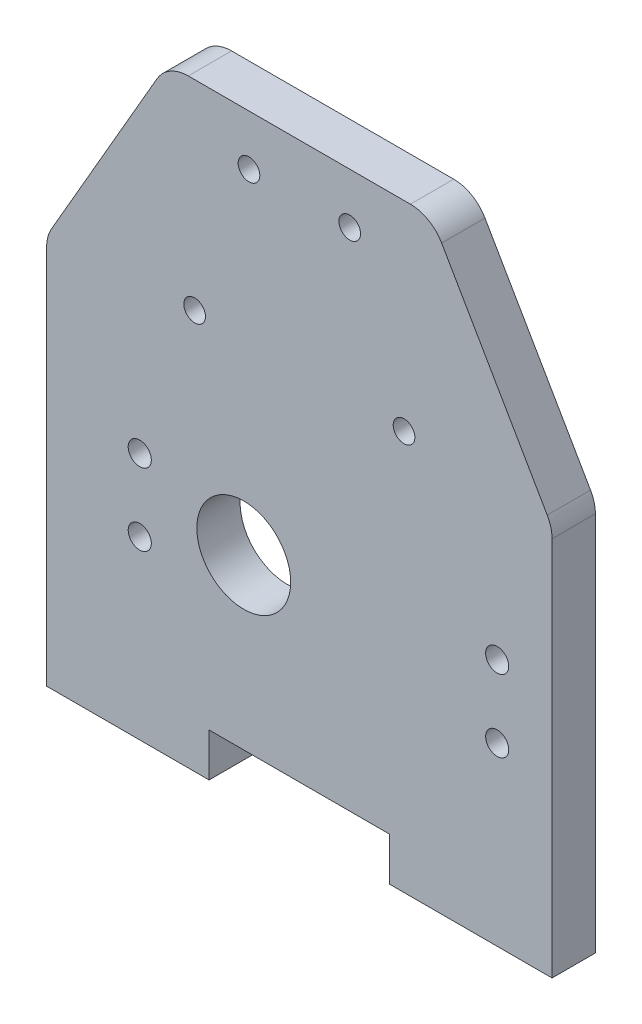
ISO-10303-21;
HEADER;
FILE_DESCRIPTION(('STEP AP214'),'2;1');
FILE_NAME('part.step','',(''),(''),'','','');
FILE_SCHEMA(('AUTOMOTIVE_DESIGN { 1 0 10303 214 1 1 1 1 }'));
ENDSEC;
DATA;
#1=APPLICATION_CONTEXT('core data for automotive mechanical design processes');
#2=APPLICATION_PROTOCOL_DEFINITION('international standard','automotive_design',2000,#1);
#3=PRODUCT_CONTEXT('',#1,'mechanical');
#4=PRODUCT('Part','Part','',(#3));
#5=PRODUCT_RELATED_PRODUCT_CATEGORY('part','',(#4));
#6=PRODUCT_DEFINITION_FORMATION('','',#4);
#7=PRODUCT_DEFINITION_CONTEXT('part definition',#1,'design');
#8=PRODUCT_DEFINITION('design','',#6,#7);
#9=PRODUCT_DEFINITION_SHAPE('','',#8);
#10=(LENGTH_UNIT() NAMED_UNIT(*) SI_UNIT(.MILLI.,.METRE.));
#11=(NAMED_UNIT(*) PLANE_ANGLE_UNIT() SI_UNIT($,.RADIAN.));
#12=(NAMED_UNIT(*) SI_UNIT($,.STERADIAN.) SOLID_ANGLE_UNIT());
#13=UNCERTAINTY_MEASURE_WITH_UNIT(LENGTH_MEASURE(1.E-05),#10,'distance_accuracy_value','');
#14=(GEOMETRIC_REPRESENTATION_CONTEXT(3) GLOBAL_UNCERTAINTY_ASSIGNED_CONTEXT((#13)) GLOBAL_UNIT_ASSIGNED_CONTEXT((#10,
#11,#12)) REPRESENTATION_CONTEXT('',''));
#15=CARTESIAN_POINT('',(0.,0.,0.));
#16=DIRECTION('',(0.,0.,1.));
#17=DIRECTION('',(1.,0.,0.));
#18=AXIS2_PLACEMENT_3D('',#15,#16,#17);
#19=CARTESIAN_POINT('',(0.,-40.,6.));
#20=DIRECTION('',(0.,1.,0.));
#21=DIRECTION('',(-1.,0.,0.));
#22=AXIS2_PLACEMENT_3D('',#19,#20,#21);
#23=PLANE('',#22);
#24=DIRECTION('',(1.,0.,0.));
#25=VECTOR('',#24,1.);
#26=CARTESIAN_POINT('',(0.,-40.,0.));
#27=LINE('',#26,#25);
#28=CARTESIAN_POINT('',(-35.,-40.,0.));
#29=VERTEX_POINT('',#28);
#30=CARTESIAN_POINT('',(-12.5,-40.,0.));
#31=VERTEX_POINT('',#30);
#32=EDGE_CURVE('E250',#29,#31,#27,.T.);
#33=ORIENTED_EDGE('',*,*,#32,.T.);
#34=DIRECTION('',(0.,0.,-1.));
#35=VECTOR('',#34,1.);
#36=CARTESIAN_POINT('',(-12.5,-40.,10.));
#37=LINE('',#36,#35);
#38=CARTESIAN_POINT('',(-12.5,-40.,6.));
#39=VERTEX_POINT('',#38);
#40=EDGE_CURVE('E170',#39,#31,#37,.T.);
#41=ORIENTED_EDGE('',*,*,#40,.F.);
#42=DIRECTION('',(1.,0.,0.));
#43=VECTOR('',#42,1.);
#44=CARTESIAN_POINT('',(0.,-40.,6.));
#45=LINE('',#44,#43);
#46=CARTESIAN_POINT('',(-35.,-40.,6.));
#47=VERTEX_POINT('',#46);
#48=EDGE_CURVE('E240',#47,#39,#45,.T.);
#49=ORIENTED_EDGE('',*,*,#48,.F.);
#50=DIRECTION('',(0.,0.,-1.));
#51=VECTOR('',#50,1.);
#52=CARTESIAN_POINT('',(-35.,-40.,6.));
#53=LINE('',#52,#51);
#54=EDGE_CURVE('E234',#47,#29,#53,.T.);
#55=ORIENTED_EDGE('',*,*,#54,.T.);
#56=EDGE_LOOP('',(#33,#41,#49,#55));
#57=FACE_BOUND('',#56,.T.);
#58=ADVANCED_FACE('F37',(#57),#23,.F.);
#59=CARTESIAN_POINT('',(12.5,-40.,6.));
#60=VERTEX_POINT('',#59);
#61=CARTESIAN_POINT('',(35.,-40.,6.));
#62=VERTEX_POINT('',#61);
#63=EDGE_CURVE('E244',#60,#62,#45,.T.);
#64=ORIENTED_EDGE('',*,*,#63,.F.);
#65=DIRECTION('',(0.,0.,-1.));
#66=VECTOR('',#65,1.);
#67=CARTESIAN_POINT('',(12.5,-40.,10.));
#68=LINE('',#67,#66);
#69=CARTESIAN_POINT('',(12.5,-40.,0.));
#70=VERTEX_POINT('',#69);
#71=EDGE_CURVE('E149',#60,#70,#68,.T.);
#72=ORIENTED_EDGE('',*,*,#71,.T.);
#73=CARTESIAN_POINT('',(35.,-40.,0.));
#74=VERTEX_POINT('',#73);
#75=EDGE_CURVE('E165',#70,#74,#27,.T.);
#76=ORIENTED_EDGE('',*,*,#75,.T.);
#77=DIRECTION('',(0.,0.,-1.));
#78=VECTOR('',#77,1.);
#79=CARTESIAN_POINT('',(35.,-40.,6.));
#80=LINE('',#79,#78);
#81=EDGE_CURVE('E249',#62,#74,#80,.T.);
#82=ORIENTED_EDGE('',*,*,#81,.F.);
#83=EDGE_LOOP('',(#64,#72,#76,#82));
#84=FACE_BOUND('',#83,.T.);
#85=ADVANCED_FACE('F315',(#84),#23,.F.);
#86=CARTESIAN_POINT('',(35.,-40.,6.));
#87=DIRECTION('',(-1.,0.,0.));
#88=DIRECTION('',(0.,-1.,0.));
#89=AXIS2_PLACEMENT_3D('',#86,#87,#88);
#90=PLANE('',#89);
#91=DIRECTION('',(0.,1.,0.));
#92=VECTOR('',#91,1.);
#93=CARTESIAN_POINT('',(35.,-40.,0.));
#94=LINE('',#93,#92);
#95=CARTESIAN_POINT('',(35.,12.6794919243112,0.));
#96=VERTEX_POINT('',#95);
#97=EDGE_CURVE('E253',#74,#96,#94,.T.);
#98=ORIENTED_EDGE('',*,*,#97,.T.);
#99=DIRECTION('',(0.,0.,-1.));
#100=VECTOR('',#99,1.);
#101=CARTESIAN_POINT('',(35.,12.6794919243112,6.));
#102=LINE('',#101,#100);
#103=CARTESIAN_POINT('',(35.,12.6794919243112,6.));
#104=VERTEX_POINT('',#103);
#105=EDGE_CURVE('E11',#96,#104,#102,.F.);
#106=ORIENTED_EDGE('',*,*,#105,.T.);
#107=DIRECTION('',(0.,1.,0.));
#108=VECTOR('',#107,1.);
#109=CARTESIAN_POINT('',(35.,-40.,6.));
#110=LINE('',#109,#108);
#111=EDGE_CURVE('E243',#62,#104,#110,.T.);
#112=ORIENTED_EDGE('',*,*,#111,.F.);
#113=ORIENTED_EDGE('',*,*,#81,.T.);
#114=EDGE_LOOP('',(#98,#106,#112,#113));
#115=FACE_BOUND('',#114,.T.);
#116=ADVANCED_FACE('F311',(#115),#90,.F.);
#117=CARTESIAN_POINT('',(35.,14.0192378864668,6.));
#118=DIRECTION('',(-0.866025403784439,-0.5,0.));
#119=DIRECTION('',(0.5,-0.866025403784439,0.));
#120=AXIS2_PLACEMENT_3D('',#117,#118,#119);
#121=PLANE('',#120);
#122=DIRECTION('',(-0.5,0.866025403784439,0.));
#123=VECTOR('',#122,1.);
#124=CARTESIAN_POINT('',(35.,14.0192378864668,6.));
#125=LINE('',#124,#123);
#126=CARTESIAN_POINT('',(34.3301270189222,15.1794919243112,6.));
#127=VERTEX_POINT('',#126);
#128=CARTESIAN_POINT('',(19.7113248654052,40.5,6.));
#129=VERTEX_POINT('',#128);
#130=EDGE_CURVE('E247',#127,#129,#125,.T.);
#131=ORIENTED_EDGE('',*,*,#130,.F.);
#132=DIRECTION('',(0.,0.,-1.));
#133=VECTOR('',#132,1.);
#134=CARTESIAN_POINT('',(34.3301270189222,15.1794919243111,6.));
#135=LINE('',#134,#133);
#136=CARTESIAN_POINT('',(34.3301270189222,15.1794919243112,0.));
#137=VERTEX_POINT('',#136);
#138=EDGE_CURVE('E46',#127,#137,#135,.T.);
#139=ORIENTED_EDGE('',*,*,#138,.T.);
#140=DIRECTION('',(-0.5,0.866025403784439,0.));
#141=VECTOR('',#140,1.);
#142=CARTESIAN_POINT('',(35.,14.0192378864668,0.));
#143=LINE('',#142,#141);
#144=CARTESIAN_POINT('',(19.7113248654052,40.5,0.));
#145=VERTEX_POINT('',#144);
#146=EDGE_CURVE('E256',#137,#145,#143,.T.);
#147=ORIENTED_EDGE('',*,*,#146,.T.);
#148=DIRECTION('',(0.,0.,1.));
#149=VECTOR('',#148,1.);
#150=CARTESIAN_POINT('',(19.7113248654052,40.5,6.));
#151=LINE('',#150,#149);
#152=EDGE_CURVE('E286',#145,#129,#151,.T.);
#153=ORIENTED_EDGE('',*,*,#152,.T.);
#154=EDGE_LOOP('',(#131,#139,#147,#153));
#155=FACE_BOUND('',#154,.T.);
#156=ADVANCED_FACE('F294',(#155),#121,.F.);
#157=CARTESIAN_POINT('',(0.,0.,6.));
#158=DIRECTION('',(0.,0.,1.));
#159=DIRECTION('',(1.,0.,0.));
#160=AXIS2_PLACEMENT_3D('',#157,#158,#159);
#161=PLANE('',#160);
#162=CARTESIAN_POINT('',(-7.70000000000001,-10.6299323621248,6.));
#163=DIRECTION('',(0.,0.,1.));
#164=DIRECTION('',(1.,0.,0.));
#165=AXIS2_PLACEMENT_3D('',#162,#163,#164);
#166=CIRCLE('',#165,6.5);
#167=CARTESIAN_POINT('',(-1.20000000000001,-10.6299323621248,6.));
#168=VERTEX_POINT('',#167);
#169=EDGE_CURVE('E324',#168,#168,#166,.T.);
#170=ORIENTED_EDGE('',*,*,#169,.F.);
#171=EDGE_LOOP('',(#170));
#172=FACE_BOUND('',#171,.T.);
#173=DIRECTION('',(0.499999999999998,0.86602540378444,0.));
#174=VECTOR('',#173,1.);
#175=CARTESIAN_POINT('',(-35.,14.0192378864667,6.));
#176=LINE('',#175,#174);
#177=CARTESIAN_POINT('',(-34.3301270189222,15.1794919243111,6.));
#178=VERTEX_POINT('',#177);
#179=CARTESIAN_POINT('',(-19.7113248654052,40.5,6.));
#180=VERTEX_POINT('',#179);
#181=EDGE_CURVE('E227',#178,#180,#176,.T.);
#182=ORIENTED_EDGE('',*,*,#181,.F.);
#183=CARTESIAN_POINT('',(-30.,12.6794919243111,6.));
#184=DIRECTION('',(0.,0.,1.));
#185=DIRECTION('',(1.,0.,0.));
#186=AXIS2_PLACEMENT_3D('',#183,#184,#185);
#187=CIRCLE('',#186,5.);
#188=CARTESIAN_POINT('',(-35.,12.6794919243111,6.));
#189=VERTEX_POINT('',#188);
#190=EDGE_CURVE('E280',#178,#189,#187,.T.);
#191=ORIENTED_EDGE('',*,*,#190,.T.);
#192=DIRECTION('',(0.,1.,0.));
#193=VECTOR('',#192,1.);
#194=CARTESIAN_POINT('',(-35.,-40.,6.));
#195=LINE('',#194,#193);
#196=EDGE_CURVE('E230',#47,#189,#195,.T.);
#197=ORIENTED_EDGE('',*,*,#196,.F.);
#198=ORIENTED_EDGE('',*,*,#48,.T.);
#199=DIRECTION('',(0.,-1.,0.));
#200=VECTOR('',#199,1.);
#201=CARTESIAN_POINT('',(-12.5,0.,6.));
#202=LINE('',#201,#200);
#203=CARTESIAN_POINT('',(-12.5,-34.,6.));
#204=VERTEX_POINT('',#203);
#205=EDGE_CURVE('E176',#204,#39,#202,.T.);
#206=ORIENTED_EDGE('',*,*,#205,.F.);
#207=DIRECTION('',(-1.,0.,0.));
#208=VECTOR('',#207,1.);
#209=CARTESIAN_POINT('',(0.,-34.,6.));
#210=LINE('',#209,#208);
#211=CARTESIAN_POINT('',(12.5,-34.,6.));
#212=VERTEX_POINT('',#211);
#213=EDGE_CURVE('E172',#212,#204,#210,.T.);
#214=ORIENTED_EDGE('',*,*,#213,.F.);
#215=DIRECTION('',(0.,1.,0.));
#216=VECTOR('',#215,1.);
#217=CARTESIAN_POINT('',(12.5,0.,6.));
#218=LINE('',#217,#216);
#219=EDGE_CURVE('E146',#60,#212,#218,.T.);
#220=ORIENTED_EDGE('',*,*,#219,.F.);
#221=ORIENTED_EDGE('',*,*,#63,.T.);
#222=ORIENTED_EDGE('',*,*,#111,.T.);
#223=CARTESIAN_POINT('',(30.,12.6794919243112,6.));
#224=DIRECTION('',(0.,0.,1.));
#225=DIRECTION('',(1.,0.,0.));
#226=AXIS2_PLACEMENT_3D('',#223,#224,#225);
#227=CIRCLE('',#226,5.);
#228=EDGE_CURVE('E277',#104,#127,#227,.T.);
#229=ORIENTED_EDGE('',*,*,#228,.T.);
#230=ORIENTED_EDGE('',*,*,#130,.T.);
#231=CARTESIAN_POINT('',(15.381197846483,38.,6.));
#232=DIRECTION('',(0.,0.,1.));
#233=DIRECTION('',(1.,0.,0.));
#234=AXIS2_PLACEMENT_3D('',#231,#232,#233);
#235=CIRCLE('',#234,5.);
#236=CARTESIAN_POINT('',(15.381197846483,43.,6.));
#237=VERTEX_POINT('',#236);
#238=EDGE_CURVE('E61',#129,#237,#235,.T.);
#239=ORIENTED_EDGE('',*,*,#238,.T.);
#240=DIRECTION('',(-1.,0.,0.));
#241=VECTOR('',#240,1.);
#242=CARTESIAN_POINT('',(-18.2679491924312,43.,6.));
#243=LINE('',#242,#241);
#244=CARTESIAN_POINT('',(-15.381197846483,43.,6.));
#245=VERTEX_POINT('',#244);
#246=EDGE_CURVE('E320',#237,#245,#243,.T.);
#247=ORIENTED_EDGE('',*,*,#246,.T.);
#248=CARTESIAN_POINT('',(-15.381197846483,38.,6.));
#249=DIRECTION('',(0.,0.,1.));
#250=DIRECTION('',(1.,0.,0.));
#251=AXIS2_PLACEMENT_3D('',#248,#249,#250);
#252=CIRCLE('',#251,5.);
#253=EDGE_CURVE('E53',#245,#180,#252,.T.);
#254=ORIENTED_EDGE('',*,*,#253,.T.);
#255=EDGE_LOOP('',(#182,#191,#197,#198,#206,#214,#220,#221,#222,#229,#230,#239,#247,#254));
#256=FACE_BOUND('',#255,.T.);
#257=CARTESIAN_POINT('',(-22.1,-5.62993236212481,6.));
#258=DIRECTION('',(0.,0.,1.));
#259=DIRECTION('',(1.,0.,0.));
#260=AXIS2_PLACEMENT_3D('',#257,#258,#259);
#261=CIRCLE('',#260,1.60000000000001);
#262=CARTESIAN_POINT('',(-20.5,-5.62993236212481,6.));
#263=VERTEX_POINT('',#262);
#264=EDGE_CURVE('E178',#263,#263,#261,.T.);
#265=ORIENTED_EDGE('',*,*,#264,.F.);
#266=EDGE_LOOP('',(#265));
#267=FACE_BOUND('',#266,.T.);
#268=CARTESIAN_POINT('',(-22.1,-15.6299323621248,6.));
#269=DIRECTION('',(0.,0.,1.));
#270=DIRECTION('',(1.,0.,0.));
#271=AXIS2_PLACEMENT_3D('',#268,#269,#270);
#272=CIRCLE('',#271,1.60000000000001);
#273=CARTESIAN_POINT('',(-20.5,-15.6299323621248,6.));
#274=VERTEX_POINT('',#273);
#275=EDGE_CURVE('E184',#274,#274,#272,.T.);
#276=ORIENTED_EDGE('',*,*,#275,.F.);
#277=EDGE_LOOP('',(#276));
#278=FACE_BOUND('',#277,.T.);
#279=CARTESIAN_POINT('',(27.4,-15.6299323621248,6.));
#280=DIRECTION('',(0.,0.,1.));
#281=DIRECTION('',(1.,0.,0.));
#282=AXIS2_PLACEMENT_3D('',#279,#280,#281);
#283=CIRCLE('',#282,1.60000000000001);
#284=CARTESIAN_POINT('',(29.,-15.6299323621248,6.));
#285=VERTEX_POINT('',#284);
#286=EDGE_CURVE('E190',#285,#285,#283,.T.);
#287=ORIENTED_EDGE('',*,*,#286,.F.);
#288=EDGE_LOOP('',(#287));
#289=FACE_BOUND('',#288,.T.);
#290=CARTESIAN_POINT('',(27.4,-5.6299323621248,6.));
#291=DIRECTION('',(0.,0.,1.));
#292=DIRECTION('',(1.,0.,0.));
#293=AXIS2_PLACEMENT_3D('',#290,#291,#292);
#294=CIRCLE('',#293,1.60000000000001);
#295=CARTESIAN_POINT('',(29.,-5.6299323621248,6.));
#296=VERTEX_POINT('',#295);
#297=EDGE_CURVE('E196',#296,#296,#294,.T.);
#298=ORIENTED_EDGE('',*,*,#297,.F.);
#299=EDGE_LOOP('',(#298));
#300=FACE_BOUND('',#299,.T.);
#301=CARTESIAN_POINT('',(6.97555684683525,36.,6.00000000000001));
#302=DIRECTION('',(0.,0.,-1.));
#303=DIRECTION('',(-1.,0.,0.));
#304=AXIS2_PLACEMENT_3D('',#301,#302,#303);
#305=CIRCLE('',#304,1.50000000000001);
#306=CARTESIAN_POINT('',(5.47555684683524,36.,6.00000000000001));
#307=VERTEX_POINT('',#306);
#308=EDGE_CURVE('E205',#307,#307,#305,.T.);
#309=ORIENTED_EDGE('',*,*,#308,.T.);
#310=EDGE_LOOP('',(#309));
#311=FACE_BOUND('',#310,.T.);
#312=CARTESIAN_POINT('',(14.5,15.32676234271,6.00000000000001));
#313=DIRECTION('',(0.,0.,-1.));
#314=DIRECTION('',(-1.,0.,0.));
#315=AXIS2_PLACEMENT_3D('',#312,#313,#314);
#316=CIRCLE('',#315,1.50000000000001);
#317=CARTESIAN_POINT('',(13.,15.32676234271,6.00000000000001));
#318=VERTEX_POINT('',#317);
#319=EDGE_CURVE('E211',#318,#318,#316,.T.);
#320=ORIENTED_EDGE('',*,*,#319,.T.);
#321=EDGE_LOOP('',(#320));
#322=FACE_BOUND('',#321,.T.);
#323=CARTESIAN_POINT('',(-14.5000000000001,15.32676234271,6.00000000000001));
#324=DIRECTION('',(0.,0.,-1.));
#325=DIRECTION('',(-1.,0.,0.));
#326=AXIS2_PLACEMENT_3D('',#323,#324,#325);
#327=CIRCLE('',#326,1.50000000000001);
#328=CARTESIAN_POINT('',(-16.0000000000001,15.32676234271,6.00000000000001));
#329=VERTEX_POINT('',#328);
#330=EDGE_CURVE('E217',#329,#329,#327,.T.);
#331=ORIENTED_EDGE('',*,*,#330,.T.);
#332=EDGE_LOOP('',(#331));
#333=FACE_BOUND('',#332,.T.);
#334=CARTESIAN_POINT('',(-6.97555684683535,36.,6.00000000000001));
#335=DIRECTION('',(0.,0.,-1.));
#336=DIRECTION('',(-1.,0.,0.));
#337=AXIS2_PLACEMENT_3D('',#334,#335,#336);
#338=CIRCLE('',#337,1.50000000000001);
#339=CARTESIAN_POINT('',(-8.47555684683537,36.,6.00000000000001));
#340=VERTEX_POINT('',#339);
#341=EDGE_CURVE('E223',#340,#340,#338,.T.);
#342=ORIENTED_EDGE('',*,*,#341,.T.);
#343=EDGE_LOOP('',(#342));
#344=FACE_BOUND('',#343,.T.);
#345=ADVANCED_FACE('F305',(#172,#256,#267,#278,#289,#300,#311,#322,#333,#344),#161,.T.);
#346=CARTESIAN_POINT('',(0.,0.,0.));
#347=DIRECTION('',(0.,0.,1.));
#348=DIRECTION('',(1.,0.,0.));
#349=AXIS2_PLACEMENT_3D('',#346,#347,#348);
#350=PLANE('',#349);
#351=CARTESIAN_POINT('',(-7.70000000000001,-10.6299323621248,0.));
#352=DIRECTION('',(0.,0.,1.));
#353=DIRECTION('',(1.,0.,0.));
#354=AXIS2_PLACEMENT_3D('',#351,#352,#353);
#355=CIRCLE('',#354,6.5);
#356=CARTESIAN_POINT('',(-1.20000000000001,-10.6299323621248,0.));
#357=VERTEX_POINT('',#356);
#358=EDGE_CURVE('E41',#357,#357,#355,.T.);
#359=ORIENTED_EDGE('',*,*,#358,.T.);
#360=EDGE_LOOP('',(#359));
#361=FACE_BOUND('',#360,.T.);
#362=CARTESIAN_POINT('',(-22.1,-5.62993236212481,0.));
#363=DIRECTION('',(0.,0.,1.));
#364=DIRECTION('',(1.,0.,0.));
#365=AXIS2_PLACEMENT_3D('',#362,#363,#364);
#366=CIRCLE('',#365,1.60000000000001);
#367=CARTESIAN_POINT('',(-20.5,-5.62993236212481,0.));
#368=VERTEX_POINT('',#367);
#369=EDGE_CURVE('E181',#368,#368,#366,.T.);
#370=ORIENTED_EDGE('',*,*,#369,.T.);
#371=EDGE_LOOP('',(#370));
#372=FACE_BOUND('',#371,.T.);
#373=CARTESIAN_POINT('',(-22.1,-15.6299323621248,0.));
#374=DIRECTION('',(0.,0.,1.));
#375=DIRECTION('',(1.,0.,0.));
#376=AXIS2_PLACEMENT_3D('',#373,#374,#375);
#377=CIRCLE('',#376,1.60000000000001);
#378=CARTESIAN_POINT('',(-20.5,-15.6299323621248,0.));
#379=VERTEX_POINT('',#378);
#380=EDGE_CURVE('E187',#379,#379,#377,.T.);
#381=ORIENTED_EDGE('',*,*,#380,.T.);
#382=EDGE_LOOP('',(#381));
#383=FACE_BOUND('',#382,.T.);
#384=CARTESIAN_POINT('',(27.4,-15.6299323621248,0.));
#385=DIRECTION('',(0.,0.,1.));
#386=DIRECTION('',(1.,0.,0.));
#387=AXIS2_PLACEMENT_3D('',#384,#385,#386);
#388=CIRCLE('',#387,1.60000000000001);
#389=CARTESIAN_POINT('',(29.,-15.6299323621248,0.));
#390=VERTEX_POINT('',#389);
#391=EDGE_CURVE('E193',#390,#390,#388,.T.);
#392=ORIENTED_EDGE('',*,*,#391,.T.);
#393=EDGE_LOOP('',(#392));
#394=FACE_BOUND('',#393,.T.);
#395=CARTESIAN_POINT('',(27.4,-5.6299323621248,0.));
#396=DIRECTION('',(0.,0.,1.));
#397=DIRECTION('',(1.,0.,0.));
#398=AXIS2_PLACEMENT_3D('',#395,#396,#397);
#399=CIRCLE('',#398,1.60000000000001);
#400=CARTESIAN_POINT('',(29.,-5.6299323621248,0.));
#401=VERTEX_POINT('',#400);
#402=EDGE_CURVE('E199',#401,#401,#399,.T.);
#403=ORIENTED_EDGE('',*,*,#402,.T.);
#404=EDGE_LOOP('',(#403));
#405=FACE_BOUND('',#404,.T.);
#406=CARTESIAN_POINT('',(6.97555684683525,36.,0.));
#407=DIRECTION('',(0.,0.,-1.));
#408=DIRECTION('',(-1.,0.,0.));
#409=AXIS2_PLACEMENT_3D('',#406,#407,#408);
#410=CIRCLE('',#409,1.50000000000001);
#411=CARTESIAN_POINT('',(5.47555684683524,36.,0.));
#412=VERTEX_POINT('',#411);
#413=EDGE_CURVE('E202',#412,#412,#410,.T.);
#414=ORIENTED_EDGE('',*,*,#413,.F.);
#415=EDGE_LOOP('',(#414));
#416=FACE_BOUND('',#415,.T.);
#417=CARTESIAN_POINT('',(14.5,15.32676234271,0.));
#418=DIRECTION('',(0.,0.,-1.));
#419=DIRECTION('',(-1.,0.,0.));
#420=AXIS2_PLACEMENT_3D('',#417,#418,#419);
#421=CIRCLE('',#420,1.50000000000002);
#422=CARTESIAN_POINT('',(13.,15.32676234271,0.));
#423=VERTEX_POINT('',#422);
#424=EDGE_CURVE('E208',#423,#423,#421,.T.);
#425=ORIENTED_EDGE('',*,*,#424,.F.);
#426=EDGE_LOOP('',(#425));
#427=FACE_BOUND('',#426,.T.);
#428=CARTESIAN_POINT('',(-14.5000000000001,15.32676234271,0.));
#429=DIRECTION('',(0.,0.,-1.));
#430=DIRECTION('',(-1.,0.,0.));
#431=AXIS2_PLACEMENT_3D('',#428,#429,#430);
#432=CIRCLE('',#431,1.50000000000001);
#433=CARTESIAN_POINT('',(-16.0000000000001,15.32676234271,0.));
#434=VERTEX_POINT('',#433);
#435=EDGE_CURVE('E214',#434,#434,#432,.T.);
#436=ORIENTED_EDGE('',*,*,#435,.F.);
#437=EDGE_LOOP('',(#436));
#438=FACE_BOUND('',#437,.T.);
#439=CARTESIAN_POINT('',(-6.97555684683535,36.,0.));
#440=DIRECTION('',(0.,0.,-1.));
#441=DIRECTION('',(-1.,0.,0.));
#442=AXIS2_PLACEMENT_3D('',#439,#440,#441);
#443=CIRCLE('',#442,1.50000000000001);
#444=CARTESIAN_POINT('',(-8.47555684683537,36.,0.));
#445=VERTEX_POINT('',#444);
#446=EDGE_CURVE('E220',#445,#445,#443,.T.);
#447=ORIENTED_EDGE('',*,*,#446,.F.);
#448=EDGE_LOOP('',(#447));
#449=FACE_BOUND('',#448,.T.);
#450=DIRECTION('',(0.,1.,0.));
#451=VECTOR('',#450,1.);
#452=CARTESIAN_POINT('',(-35.,-40.,0.));
#453=LINE('',#452,#451);
#454=CARTESIAN_POINT('',(-35.,12.6794919243111,0.));
#455=VERTEX_POINT('',#454);
#456=EDGE_CURVE('E231',#29,#455,#453,.T.);
#457=ORIENTED_EDGE('',*,*,#456,.T.);
#458=CARTESIAN_POINT('',(-30.,12.6794919243111,0.));
#459=DIRECTION('',(0.,0.,1.));
#460=DIRECTION('',(1.,0.,0.));
#461=AXIS2_PLACEMENT_3D('',#458,#459,#460);
#462=CIRCLE('',#461,5.);
#463=CARTESIAN_POINT('',(-34.3301270189222,15.1794919243111,0.));
#464=VERTEX_POINT('',#463);
#465=EDGE_CURVE('E270',#455,#464,#462,.F.);
#466=ORIENTED_EDGE('',*,*,#465,.T.);
#467=DIRECTION('',(0.499999999999998,0.86602540378444,0.));
#468=VECTOR('',#467,1.);
#469=CARTESIAN_POINT('',(-35.,14.0192378864667,0.));
#470=LINE('',#469,#468);
#471=CARTESIAN_POINT('',(-19.7113248654052,40.5,0.));
#472=VERTEX_POINT('',#471);
#473=EDGE_CURVE('E226',#464,#472,#470,.T.);
#474=ORIENTED_EDGE('',*,*,#473,.T.);
#475=CARTESIAN_POINT('',(-15.381197846483,38.,0.));
#476=DIRECTION('',(0.,0.,1.));
#477=DIRECTION('',(1.,0.,0.));
#478=AXIS2_PLACEMENT_3D('',#475,#476,#477);
#479=CIRCLE('',#478,5.);
#480=CARTESIAN_POINT('',(-15.381197846483,43.,0.));
#481=VERTEX_POINT('',#480);
#482=EDGE_CURVE('E268',#472,#481,#479,.F.);
#483=ORIENTED_EDGE('',*,*,#482,.T.);
#484=DIRECTION('',(-1.,0.,0.));
#485=VECTOR('',#484,1.);
#486=CARTESIAN_POINT('',(-18.2679491924312,43.,0.));
#487=LINE('',#486,#485);
#488=CARTESIAN_POINT('',(15.381197846483,43.,0.));
#489=VERTEX_POINT('',#488);
#490=EDGE_CURVE('E301',#489,#481,#487,.T.);
#491=ORIENTED_EDGE('',*,*,#490,.F.);
#492=CARTESIAN_POINT('',(15.381197846483,38.,0.));
#493=DIRECTION('',(0.,0.,1.));
#494=DIRECTION('',(1.,0.,0.));
#495=AXIS2_PLACEMENT_3D('',#492,#493,#494);
#496=CIRCLE('',#495,5.);
#497=EDGE_CURVE('E264',#489,#145,#496,.F.);
#498=ORIENTED_EDGE('',*,*,#497,.T.);
#499=ORIENTED_EDGE('',*,*,#146,.F.);
#500=CARTESIAN_POINT('',(30.,12.6794919243112,0.));
#501=DIRECTION('',(0.,0.,1.));
#502=DIRECTION('',(1.,0.,0.));
#503=AXIS2_PLACEMENT_3D('',#500,#501,#502);
#504=CIRCLE('',#503,5.);
#505=EDGE_CURVE('E266',#137,#96,#504,.F.);
#506=ORIENTED_EDGE('',*,*,#505,.T.);
#507=ORIENTED_EDGE('',*,*,#97,.F.);
#508=ORIENTED_EDGE('',*,*,#75,.F.);
#509=DIRECTION('',(0.,-1.,0.));
#510=VECTOR('',#509,1.);
#511=CARTESIAN_POINT('',(12.5,-34.,0.));
#512=LINE('',#511,#510);
#513=CARTESIAN_POINT('',(12.5,-34.,0.));
#514=VERTEX_POINT('',#513);
#515=EDGE_CURVE('E143',#514,#70,#512,.T.);
#516=ORIENTED_EDGE('',*,*,#515,.F.);
#517=DIRECTION('',(1.,0.,0.));
#518=VECTOR('',#517,1.);
#519=CARTESIAN_POINT('',(-12.5,-34.,0.));
#520=LINE('',#519,#518);
#521=CARTESIAN_POINT('',(-12.5,-34.,0.));
#522=VERTEX_POINT('',#521);
#523=EDGE_CURVE('E154',#522,#514,#520,.T.);
#524=ORIENTED_EDGE('',*,*,#523,.F.);
#525=DIRECTION('',(0.,1.,0.));
#526=VECTOR('',#525,1.);
#527=CARTESIAN_POINT('',(-12.5,-40.,0.));
#528=LINE('',#527,#526);
#529=EDGE_CURVE('E159',#31,#522,#528,.T.);
#530=ORIENTED_EDGE('',*,*,#529,.F.);
#531=ORIENTED_EDGE('',*,*,#32,.F.);
#532=EDGE_LOOP('',(#457,#466,#474,#483,#491,#498,#499,#506,#507,#508,#516,#524,#530,#531));
#533=FACE_BOUND('',#532,.T.);
#534=ADVANCED_FACE('F163',(#361,#372,#383,#394,#405,#416,#427,#438,#449,#533),#350,.F.);
#535=CARTESIAN_POINT('',(-35.,14.0192378864667,6.));
#536=DIRECTION('',(-0.86602540378444,0.499999999999998,0.));
#537=DIRECTION('',(-0.499999999999998,-0.86602540378444,0.));
#538=AXIS2_PLACEMENT_3D('',#535,#536,#537);
#539=PLANE('',#538);
#540=ORIENTED_EDGE('',*,*,#473,.F.);
#541=DIRECTION('',(0.,0.,-1.));
#542=VECTOR('',#541,1.);
#543=CARTESIAN_POINT('',(-34.3301270189222,15.1794919243111,6.));
#544=LINE('',#543,#542);
#545=EDGE_CURVE('E274',#464,#178,#544,.F.);
#546=ORIENTED_EDGE('',*,*,#545,.T.);
#547=ORIENTED_EDGE('',*,*,#181,.T.);
#548=DIRECTION('',(0.,0.,1.));
#549=VECTOR('',#548,1.);
#550=CARTESIAN_POINT('',(-19.7113248654052,40.5,6.));
#551=LINE('',#550,#549);
#552=EDGE_CURVE('E272',#180,#472,#551,.F.);
#553=ORIENTED_EDGE('',*,*,#552,.T.);
#554=EDGE_LOOP('',(#540,#546,#547,#553));
#555=FACE_BOUND('',#554,.T.);
#556=ADVANCED_FACE('F385',(#555),#539,.T.);
#557=CARTESIAN_POINT('',(-35.,-40.,6.));
#558=DIRECTION('',(-1.,0.,0.));
#559=DIRECTION('',(0.,-1.,0.));
#560=AXIS2_PLACEMENT_3D('',#557,#558,#559);
#561=PLANE('',#560);
#562=ORIENTED_EDGE('',*,*,#196,.T.);
#563=DIRECTION('',(0.,0.,-1.));
#564=VECTOR('',#563,1.);
#565=CARTESIAN_POINT('',(-35.,12.6794919243111,6.));
#566=LINE('',#565,#564);
#567=EDGE_CURVE('E261',#189,#455,#566,.T.);
#568=ORIENTED_EDGE('',*,*,#567,.T.);
#569=ORIENTED_EDGE('',*,*,#456,.F.);
#570=ORIENTED_EDGE('',*,*,#54,.F.);
#571=EDGE_LOOP('',(#562,#568,#569,#570));
#572=FACE_BOUND('',#571,.T.);
#573=ADVANCED_FACE('F399',(#572),#561,.T.);
#574=CARTESIAN_POINT('',(-6.97555684683535,36.,0.));
#575=DIRECTION('',(0.,0.,-1.));
#576=DIRECTION('',(-1.,0.,0.));
#577=AXIS2_PLACEMENT_3D('',#574,#575,#576);
#578=CYLINDRICAL_SURFACE('',#577,1.50000000000001);
#579=ORIENTED_EDGE('',*,*,#341,.F.);
#580=EDGE_LOOP('',(#579));
#581=FACE_BOUND('',#580,.T.);
#582=ORIENTED_EDGE('',*,*,#446,.T.);
#583=EDGE_LOOP('',(#582));
#584=FACE_BOUND('',#583,.T.);
#585=ADVANCED_FACE('F407',(#581,#584),#578,.F.);
#586=CARTESIAN_POINT('',(-14.5000000000001,15.32676234271,0.));
#587=DIRECTION('',(0.,0.,-1.));
#588=DIRECTION('',(-1.,0.,0.));
#589=AXIS2_PLACEMENT_3D('',#586,#587,#588);
#590=CYLINDRICAL_SURFACE('',#589,1.50000000000001);
#591=ORIENTED_EDGE('',*,*,#330,.F.);
#592=EDGE_LOOP('',(#591));
#593=FACE_BOUND('',#592,.T.);
#594=ORIENTED_EDGE('',*,*,#435,.T.);
#595=EDGE_LOOP('',(#594));
#596=FACE_BOUND('',#595,.T.);
#597=ADVANCED_FACE('F416',(#593,#596),#590,.F.);
#598=CARTESIAN_POINT('',(14.5,15.32676234271,0.));
#599=DIRECTION('',(0.,0.,-1.));
#600=DIRECTION('',(-1.,0.,0.));
#601=AXIS2_PLACEMENT_3D('',#598,#599,#600);
#602=CYLINDRICAL_SURFACE('',#601,1.50000000000001);
#603=ORIENTED_EDGE('',*,*,#319,.F.);
#604=EDGE_LOOP('',(#603));
#605=FACE_BOUND('',#604,.T.);
#606=ORIENTED_EDGE('',*,*,#424,.T.);
#607=EDGE_LOOP('',(#606));
#608=FACE_BOUND('',#607,.T.);
#609=ADVANCED_FACE('F424',(#605,#608),#602,.F.);
#610=CARTESIAN_POINT('',(6.97555684683525,36.,0.));
#611=DIRECTION('',(0.,0.,-1.));
#612=DIRECTION('',(-1.,0.,0.));
#613=AXIS2_PLACEMENT_3D('',#610,#611,#612);
#614=CYLINDRICAL_SURFACE('',#613,1.50000000000001);
#615=ORIENTED_EDGE('',*,*,#308,.F.);
#616=EDGE_LOOP('',(#615));
#617=FACE_BOUND('',#616,.T.);
#618=ORIENTED_EDGE('',*,*,#413,.T.);
#619=EDGE_LOOP('',(#618));
#620=FACE_BOUND('',#619,.T.);
#621=ADVANCED_FACE('F432',(#617,#620),#614,.F.);
#622=CARTESIAN_POINT('',(27.4,-5.6299323621248,6.));
#623=DIRECTION('',(0.,0.,1.));
#624=DIRECTION('',(1.,0.,0.));
#625=AXIS2_PLACEMENT_3D('',#622,#623,#624);
#626=CYLINDRICAL_SURFACE('',#625,1.60000000000001);
#627=ORIENTED_EDGE('',*,*,#402,.F.);
#628=EDGE_LOOP('',(#627));
#629=FACE_BOUND('',#628,.T.);
#630=ORIENTED_EDGE('',*,*,#297,.T.);
#631=EDGE_LOOP('',(#630));
#632=FACE_BOUND('',#631,.T.);
#633=ADVANCED_FACE('F440',(#629,#632),#626,.F.);
#634=CARTESIAN_POINT('',(27.4,-15.6299323621248,6.));
#635=DIRECTION('',(0.,0.,1.));
#636=DIRECTION('',(1.,0.,0.));
#637=AXIS2_PLACEMENT_3D('',#634,#635,#636);
#638=CYLINDRICAL_SURFACE('',#637,1.60000000000001);
#639=ORIENTED_EDGE('',*,*,#391,.F.);
#640=EDGE_LOOP('',(#639));
#641=FACE_BOUND('',#640,.T.);
#642=ORIENTED_EDGE('',*,*,#286,.T.);
#643=EDGE_LOOP('',(#642));
#644=FACE_BOUND('',#643,.T.);
#645=ADVANCED_FACE('F448',(#641,#644),#638,.F.);
#646=CARTESIAN_POINT('',(-22.1,-15.6299323621248,6.));
#647=DIRECTION('',(0.,0.,1.));
#648=DIRECTION('',(1.,0.,0.));
#649=AXIS2_PLACEMENT_3D('',#646,#647,#648);
#650=CYLINDRICAL_SURFACE('',#649,1.60000000000001);
#651=ORIENTED_EDGE('',*,*,#380,.F.);
#652=EDGE_LOOP('',(#651));
#653=FACE_BOUND('',#652,.T.);
#654=ORIENTED_EDGE('',*,*,#275,.T.);
#655=EDGE_LOOP('',(#654));
#656=FACE_BOUND('',#655,.T.);
#657=ADVANCED_FACE('F456',(#653,#656),#650,.F.);
#658=CARTESIAN_POINT('',(-22.1,-5.62993236212481,6.));
#659=DIRECTION('',(0.,0.,1.));
#660=DIRECTION('',(1.,0.,0.));
#661=AXIS2_PLACEMENT_3D('',#658,#659,#660);
#662=CYLINDRICAL_SURFACE('',#661,1.60000000000001);
#663=ORIENTED_EDGE('',*,*,#369,.F.);
#664=EDGE_LOOP('',(#663));
#665=FACE_BOUND('',#664,.T.);
#666=ORIENTED_EDGE('',*,*,#264,.T.);
#667=EDGE_LOOP('',(#666));
#668=FACE_BOUND('',#667,.T.);
#669=ADVANCED_FACE('F464',(#665,#668),#662,.F.);
#670=CARTESIAN_POINT('',(-12.5,-40.,10.));
#671=DIRECTION('',(-1.,0.,0.));
#672=DIRECTION('',(0.,0.,1.));
#673=AXIS2_PLACEMENT_3D('',#670,#671,#672);
#674=PLANE('',#673);
#675=ORIENTED_EDGE('',*,*,#205,.T.);
#676=ORIENTED_EDGE('',*,*,#40,.T.);
#677=ORIENTED_EDGE('',*,*,#529,.T.);
#678=DIRECTION('',(0.,0.,-1.));
#679=VECTOR('',#678,1.);
#680=CARTESIAN_POINT('',(-12.5,-34.,10.));
#681=LINE('',#680,#679);
#682=EDGE_CURVE('E150',#204,#522,#681,.T.);
#683=ORIENTED_EDGE('',*,*,#682,.F.);
#684=EDGE_LOOP('',(#675,#676,#677,#683));
#685=FACE_BOUND('',#684,.T.);
#686=ADVANCED_FACE('F318',(#685),#674,.F.);
#687=CARTESIAN_POINT('',(12.5,-34.,10.));
#688=DIRECTION('',(1.,0.,0.));
#689=DIRECTION('',(0.,0.,-1.));
#690=AXIS2_PLACEMENT_3D('',#687,#688,#689);
#691=PLANE('',#690);
#692=ORIENTED_EDGE('',*,*,#219,.T.);
#693=DIRECTION('',(0.,0.,-1.));
#694=VECTOR('',#693,1.);
#695=CARTESIAN_POINT('',(12.5,-34.,10.));
#696=LINE('',#695,#694);
#697=EDGE_CURVE('E139',#212,#514,#696,.T.);
#698=ORIENTED_EDGE('',*,*,#697,.T.);
#699=ORIENTED_EDGE('',*,*,#515,.T.);
#700=ORIENTED_EDGE('',*,*,#71,.F.);
#701=EDGE_LOOP('',(#692,#698,#699,#700));
#702=FACE_BOUND('',#701,.T.);
#703=ADVANCED_FACE('F141',(#702),#691,.F.);
#704=CARTESIAN_POINT('',(-12.5,-34.,10.));
#705=DIRECTION('',(0.,1.,0.));
#706=DIRECTION('',(-1.,0.,0.));
#707=AXIS2_PLACEMENT_3D('',#704,#705,#706);
#708=PLANE('',#707);
#709=ORIENTED_EDGE('',*,*,#213,.T.);
#710=ORIENTED_EDGE('',*,*,#682,.T.);
#711=ORIENTED_EDGE('',*,*,#523,.T.);
#712=ORIENTED_EDGE('',*,*,#697,.F.);
#713=EDGE_LOOP('',(#709,#710,#711,#712));
#714=FACE_BOUND('',#713,.T.);
#715=ADVANCED_FACE('F155',(#714),#708,.F.);
#716=CARTESIAN_POINT('',(-18.2679491924312,43.,0.));
#717=DIRECTION('',(0.,1.,0.));
#718=DIRECTION('',(0.,0.,1.));
#719=AXIS2_PLACEMENT_3D('',#716,#717,#718);
#720=PLANE('',#719);
#721=ORIENTED_EDGE('',*,*,#490,.T.);
#722=DIRECTION('',(0.,0.,1.));
#723=VECTOR('',#722,1.);
#724=CARTESIAN_POINT('',(-15.381197846483,43.,0.));
#725=LINE('',#724,#723);
#726=EDGE_CURVE('E284',#481,#245,#725,.T.);
#727=ORIENTED_EDGE('',*,*,#726,.T.);
#728=ORIENTED_EDGE('',*,*,#246,.F.);
#729=DIRECTION('',(0.,0.,1.));
#730=VECTOR('',#729,1.);
#731=CARTESIAN_POINT('',(15.381197846483,43.,0.));
#732=LINE('',#731,#730);
#733=EDGE_CURVE('E282',#237,#489,#732,.F.);
#734=ORIENTED_EDGE('',*,*,#733,.T.);
#735=EDGE_LOOP('',(#721,#727,#728,#734));
#736=FACE_BOUND('',#735,.T.);
#737=ADVANCED_FACE('F353',(#736),#720,.T.);
#738=CARTESIAN_POINT('',(-30.,12.6794919243111,6.));
#739=DIRECTION('',(0.,0.,-1.));
#740=DIRECTION('',(-1.,0.,0.));
#741=AXIS2_PLACEMENT_3D('',#738,#739,#740);
#742=CYLINDRICAL_SURFACE('',#741,5.);
#743=ORIENTED_EDGE('',*,*,#190,.F.);
#744=ORIENTED_EDGE('',*,*,#545,.F.);
#745=ORIENTED_EDGE('',*,*,#465,.F.);
#746=ORIENTED_EDGE('',*,*,#567,.F.);
#747=EDGE_LOOP('',(#743,#744,#745,#746));
#748=FACE_BOUND('',#747,.T.);
#749=ADVANCED_FACE('F349',(#748),#742,.T.);
#750=CARTESIAN_POINT('',(-15.381197846483,38.,0.));
#751=DIRECTION('',(0.,0.,1.));
#752=DIRECTION('',(1.,0.,0.));
#753=AXIS2_PLACEMENT_3D('',#750,#751,#752);
#754=CYLINDRICAL_SURFACE('',#753,5.);
#755=ORIENTED_EDGE('',*,*,#482,.F.);
#756=ORIENTED_EDGE('',*,*,#552,.F.);
#757=ORIENTED_EDGE('',*,*,#253,.F.);
#758=ORIENTED_EDGE('',*,*,#726,.F.);
#759=EDGE_LOOP('',(#755,#756,#757,#758));
#760=FACE_BOUND('',#759,.T.);
#761=ADVANCED_FACE('F352',(#760),#754,.T.);
#762=CARTESIAN_POINT('',(30.,12.6794919243112,6.));
#763=DIRECTION('',(0.,0.,-1.));
#764=DIRECTION('',(-1.,0.,0.));
#765=AXIS2_PLACEMENT_3D('',#762,#763,#764);
#766=CYLINDRICAL_SURFACE('',#765,5.);
#767=ORIENTED_EDGE('',*,*,#228,.F.);
#768=ORIENTED_EDGE('',*,*,#105,.F.);
#769=ORIENTED_EDGE('',*,*,#505,.F.);
#770=ORIENTED_EDGE('',*,*,#138,.F.);
#771=EDGE_LOOP('',(#767,#768,#769,#770));
#772=FACE_BOUND('',#771,.T.);
#773=ADVANCED_FACE('F309',(#772),#766,.T.);
#774=CARTESIAN_POINT('',(15.381197846483,38.,6.));
#775=DIRECTION('',(0.,0.,-1.));
#776=DIRECTION('',(-1.,0.,0.));
#777=AXIS2_PLACEMENT_3D('',#774,#775,#776);
#778=CYLINDRICAL_SURFACE('',#777,5.);
#779=ORIENTED_EDGE('',*,*,#497,.F.);
#780=ORIENTED_EDGE('',*,*,#733,.F.);
#781=ORIENTED_EDGE('',*,*,#238,.F.);
#782=ORIENTED_EDGE('',*,*,#152,.F.);
#783=EDGE_LOOP('',(#779,#780,#781,#782));
#784=FACE_BOUND('',#783,.T.);
#785=ADVANCED_FACE('F39',(#784),#778,.T.);
#786=CARTESIAN_POINT('',(-7.70000000000001,-10.6299323621248,-4.));
#787=DIRECTION('',(0.,0.,1.));
#788=DIRECTION('',(1.,0.,0.));
#789=AXIS2_PLACEMENT_3D('',#786,#787,#788);
#790=CYLINDRICAL_SURFACE('',#789,6.5);
#791=ORIENTED_EDGE('',*,*,#169,.T.);
#792=EDGE_LOOP('',(#791));
#793=FACE_BOUND('',#792,.T.);
#794=ORIENTED_EDGE('',*,*,#358,.F.);
#795=EDGE_LOOP('',(#794));
#796=FACE_BOUND('',#795,.T.);
#797=ADVANCED_FACE('F333',(#793,#796),#790,.F.);
#798=CLOSED_SHELL('',(#58,#85,#116,#156,#345,#534,#556,#573,#585,#597,#609,#621,#633,#645,#657,
#669,#686,#703,#715,#737,#749,#761,#773,#785,#797));
#799=MANIFOLD_SOLID_BREP('B2',#798);
#800=ADVANCED_BREP_SHAPE_REPRESENTATION('',(#18,#799),#14);
#801=SHAPE_DEFINITION_REPRESENTATION(#9,#800);
ENDSEC;
END-ISO-10303-21;
